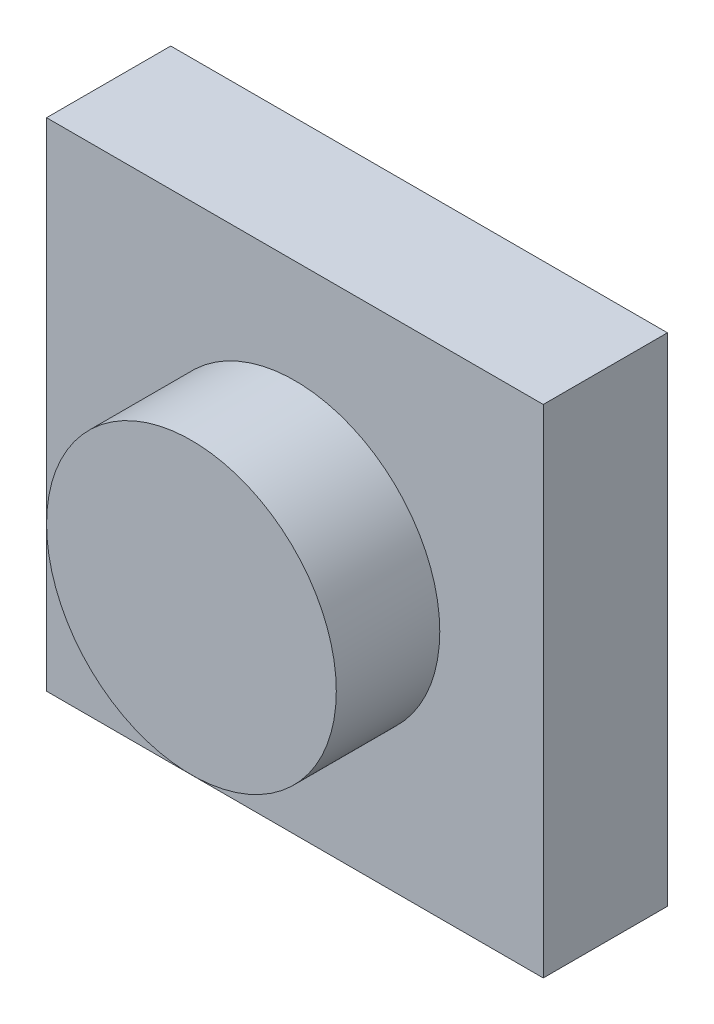
ISO-10303-21;
HEADER;
FILE_DESCRIPTION(('STEP AP214'),'2;1');
FILE_NAME('part.step','',(''),(''),'','','');
FILE_SCHEMA(('AUTOMOTIVE_DESIGN { 1 0 10303 214 1 1 1 1 }'));
ENDSEC;
DATA;
#1=APPLICATION_CONTEXT('core data for automotive mechanical design processes');
#2=APPLICATION_PROTOCOL_DEFINITION('international standard','automotive_design',2000,#1);
#3=PRODUCT_CONTEXT('',#1,'mechanical');
#4=PRODUCT('Part','Part','',(#3));
#5=PRODUCT_RELATED_PRODUCT_CATEGORY('part','',(#4));
#6=PRODUCT_DEFINITION_FORMATION('','',#4);
#7=PRODUCT_DEFINITION_CONTEXT('part definition',#1,'design');
#8=PRODUCT_DEFINITION('design','',#6,#7);
#9=PRODUCT_DEFINITION_SHAPE('','',#8);
#10=(LENGTH_UNIT() NAMED_UNIT(*) SI_UNIT(.MILLI.,.METRE.));
#11=(NAMED_UNIT(*) PLANE_ANGLE_UNIT() SI_UNIT($,.RADIAN.));
#12=(NAMED_UNIT(*) SI_UNIT($,.STERADIAN.) SOLID_ANGLE_UNIT());
#13=UNCERTAINTY_MEASURE_WITH_UNIT(LENGTH_MEASURE(1.E-05),#10,'distance_accuracy_value','');
#14=(GEOMETRIC_REPRESENTATION_CONTEXT(3) GLOBAL_UNCERTAINTY_ASSIGNED_CONTEXT((#13)) GLOBAL_UNIT_ASSIGNED_CONTEXT((#10,
#11,#12)) REPRESENTATION_CONTEXT('',''));
#15=CARTESIAN_POINT('',(0.,0.,0.));
#16=DIRECTION('',(0.,0.,1.));
#17=DIRECTION('',(1.,0.,0.));
#18=AXIS2_PLACEMENT_3D('',#15,#16,#17);
#19=CARTESIAN_POINT('',(0.,120.,30.));
#20=DIRECTION('',(0.,0.,-1.));
#21=DIRECTION('',(-1.,0.,0.));
#22=AXIS2_PLACEMENT_3D('',#19,#20,#21);
#23=PLANE('',#22);
#24=DIRECTION('',(0.,-1.,0.));
#25=VECTOR('',#24,1.);
#26=CARTESIAN_POINT('',(0.,0.,30.));
#27=LINE('',#26,#25);
#28=CARTESIAN_POINT('',(0.,120.,30.));
#29=VERTEX_POINT('',#28);
#30=CARTESIAN_POINT('',(0.,0.,30.));
#31=VERTEX_POINT('',#30);
#32=EDGE_CURVE('E93',#29,#31,#27,.T.);
#33=ORIENTED_EDGE('',*,*,#32,.T.);
#34=DIRECTION('',(1.,0.,0.));
#35=VECTOR('',#34,1.);
#36=CARTESIAN_POINT('',(0.,0.,30.));
#37=LINE('',#36,#35);
#38=CARTESIAN_POINT('',(120.,0.,30.));
#39=VERTEX_POINT('',#38);
#40=EDGE_CURVE('E88',#31,#39,#37,.T.);
#41=ORIENTED_EDGE('',*,*,#40,.T.);
#42=DIRECTION('',(0.,1.,0.));
#43=VECTOR('',#42,1.);
#44=CARTESIAN_POINT('',(120.,0.,30.));
#45=LINE('',#44,#43);
#46=CARTESIAN_POINT('',(120.,120.,30.));
#47=VERTEX_POINT('',#46);
#48=EDGE_CURVE('E91',#39,#47,#45,.T.);
#49=ORIENTED_EDGE('',*,*,#48,.T.);
#50=DIRECTION('',(-1.,0.,0.));
#51=VECTOR('',#50,1.);
#52=CARTESIAN_POINT('',(0.,120.,30.));
#53=LINE('',#52,#51);
#54=EDGE_CURVE('E57',#47,#29,#53,.T.);
#55=ORIENTED_EDGE('',*,*,#54,.T.);
#56=EDGE_LOOP('',(#33,#41,#49,#55));
#57=FACE_BOUND('',#56,.T.);
#58=CARTESIAN_POINT('',(60.,60.,30.));
#59=DIRECTION('',(0.,0.,-1.));
#60=DIRECTION('',(-1.,0.,0.));
#61=AXIS2_PLACEMENT_3D('',#58,#59,#60);
#62=CIRCLE('',#61,35.);
#63=CARTESIAN_POINT('',(25.,60.,30.));
#64=VERTEX_POINT('',#63);
#65=EDGE_CURVE('E11',#64,#64,#62,.F.);
#66=ORIENTED_EDGE('',*,*,#65,.F.);
#67=EDGE_LOOP('',(#66));
#68=FACE_BOUND('',#67,.T.);
#69=ADVANCED_FACE('F40',(#57,#68),#23,.F.);
#70=CARTESIAN_POINT('',(0.,0.,30.));
#71=DIRECTION('',(1.,0.,0.));
#72=DIRECTION('',(0.,1.,0.));
#73=AXIS2_PLACEMENT_3D('',#70,#71,#72);
#74=PLANE('',#73);
#75=DIRECTION('',(0.,-1.,0.));
#76=VECTOR('',#75,1.);
#77=CARTESIAN_POINT('',(0.,0.,0.));
#78=LINE('',#77,#76);
#79=CARTESIAN_POINT('',(0.,120.,0.));
#80=VERTEX_POINT('',#79);
#81=CARTESIAN_POINT('',(0.,0.,0.));
#82=VERTEX_POINT('',#81);
#83=EDGE_CURVE('E107',#80,#82,#78,.T.);
#84=ORIENTED_EDGE('',*,*,#83,.T.);
#85=DIRECTION('',(0.,0.,-1.));
#86=VECTOR('',#85,1.);
#87=CARTESIAN_POINT('',(0.,0.,30.));
#88=LINE('',#87,#86);
#89=EDGE_CURVE('E49',#31,#82,#88,.T.);
#90=ORIENTED_EDGE('',*,*,#89,.F.);
#91=ORIENTED_EDGE('',*,*,#32,.F.);
#92=DIRECTION('',(0.,0.,-1.));
#93=VECTOR('',#92,1.);
#94=CARTESIAN_POINT('',(0.,120.,30.));
#95=LINE('',#94,#93);
#96=EDGE_CURVE('E103',#29,#80,#95,.T.);
#97=ORIENTED_EDGE('',*,*,#96,.T.);
#98=EDGE_LOOP('',(#84,#90,#91,#97));
#99=FACE_BOUND('',#98,.T.);
#100=ADVANCED_FACE('F42',(#99),#74,.F.);
#101=CARTESIAN_POINT('',(0.,0.,30.));
#102=DIRECTION('',(0.,1.,0.));
#103=DIRECTION('',(0.,0.,1.));
#104=AXIS2_PLACEMENT_3D('',#101,#102,#103);
#105=PLANE('',#104);
#106=DIRECTION('',(1.,0.,0.));
#107=VECTOR('',#106,1.);
#108=CARTESIAN_POINT('',(0.,0.,0.));
#109=LINE('',#108,#107);
#110=CARTESIAN_POINT('',(120.,0.,0.));
#111=VERTEX_POINT('',#110);
#112=EDGE_CURVE('E98',#82,#111,#109,.T.);
#113=ORIENTED_EDGE('',*,*,#112,.T.);
#114=DIRECTION('',(0.,0.,-1.));
#115=VECTOR('',#114,1.);
#116=CARTESIAN_POINT('',(120.,0.,30.));
#117=LINE('',#116,#115);
#118=EDGE_CURVE('E96',#39,#111,#117,.T.);
#119=ORIENTED_EDGE('',*,*,#118,.F.);
#120=ORIENTED_EDGE('',*,*,#40,.F.);
#121=ORIENTED_EDGE('',*,*,#89,.T.);
#122=EDGE_LOOP('',(#113,#119,#120,#121));
#123=FACE_BOUND('',#122,.T.);
#124=ADVANCED_FACE('F97',(#123),#105,.F.);
#125=CARTESIAN_POINT('',(120.,0.,30.));
#126=DIRECTION('',(-1.,0.,0.));
#127=DIRECTION('',(0.,-1.,0.));
#128=AXIS2_PLACEMENT_3D('',#125,#126,#127);
#129=PLANE('',#128);
#130=DIRECTION('',(0.,1.,0.));
#131=VECTOR('',#130,1.);
#132=CARTESIAN_POINT('',(120.,0.,0.));
#133=LINE('',#132,#131);
#134=CARTESIAN_POINT('',(120.,120.,0.));
#135=VERTEX_POINT('',#134);
#136=EDGE_CURVE('E74',#111,#135,#133,.T.);
#137=ORIENTED_EDGE('',*,*,#136,.T.);
#138=DIRECTION('',(0.,0.,-1.));
#139=VECTOR('',#138,1.);
#140=CARTESIAN_POINT('',(120.,120.,30.));
#141=LINE('',#140,#139);
#142=EDGE_CURVE('E99',#47,#135,#141,.T.);
#143=ORIENTED_EDGE('',*,*,#142,.F.);
#144=ORIENTED_EDGE('',*,*,#48,.F.);
#145=ORIENTED_EDGE('',*,*,#118,.T.);
#146=EDGE_LOOP('',(#137,#143,#144,#145));
#147=FACE_BOUND('',#146,.T.);
#148=ADVANCED_FACE('F101',(#147),#129,.F.);
#149=CARTESIAN_POINT('',(0.,120.,30.));
#150=DIRECTION('',(0.,-1.,0.));
#151=DIRECTION('',(0.,0.,-1.));
#152=AXIS2_PLACEMENT_3D('',#149,#150,#151);
#153=PLANE('',#152);
#154=DIRECTION('',(-1.,0.,0.));
#155=VECTOR('',#154,1.);
#156=CARTESIAN_POINT('',(0.,120.,0.));
#157=LINE('',#156,#155);
#158=EDGE_CURVE('E80',#135,#80,#157,.T.);
#159=ORIENTED_EDGE('',*,*,#158,.T.);
#160=ORIENTED_EDGE('',*,*,#96,.F.);
#161=ORIENTED_EDGE('',*,*,#54,.F.);
#162=ORIENTED_EDGE('',*,*,#142,.T.);
#163=EDGE_LOOP('',(#159,#160,#161,#162));
#164=FACE_BOUND('',#163,.T.);
#165=ADVANCED_FACE('F121',(#164),#153,.F.);
#166=CARTESIAN_POINT('',(0.,120.,0.));
#167=DIRECTION('',(0.,0.,-1.));
#168=DIRECTION('',(-1.,0.,0.));
#169=AXIS2_PLACEMENT_3D('',#166,#167,#168);
#170=PLANE('',#169);
#171=ORIENTED_EDGE('',*,*,#83,.F.);
#172=ORIENTED_EDGE('',*,*,#158,.F.);
#173=ORIENTED_EDGE('',*,*,#136,.F.);
#174=ORIENTED_EDGE('',*,*,#112,.F.);
#175=EDGE_LOOP('',(#171,#172,#173,#174));
#176=FACE_BOUND('',#175,.T.);
#177=ADVANCED_FACE('F118',(#176),#170,.T.);
#178=CARTESIAN_POINT('',(60.,60.,55.));
#179=DIRECTION('',(0.,0.,-1.));
#180=DIRECTION('',(-1.,0.,0.));
#181=AXIS2_PLACEMENT_3D('',#178,#179,#180);
#182=CYLINDRICAL_SURFACE('',#181,35.);
#183=CARTESIAN_POINT('',(60.,60.,55.));
#184=DIRECTION('',(0.,0.,1.));
#185=DIRECTION('',(1.,0.,0.));
#186=AXIS2_PLACEMENT_3D('',#183,#184,#185);
#187=CIRCLE('',#186,35.);
#188=CARTESIAN_POINT('',(95.,60.,55.));
#189=VERTEX_POINT('',#188);
#190=EDGE_CURVE('E110',#189,#189,#187,.T.);
#191=ORIENTED_EDGE('',*,*,#190,.F.);
#192=EDGE_LOOP('',(#191));
#193=FACE_BOUND('',#192,.T.);
#194=ORIENTED_EDGE('',*,*,#65,.T.);
#195=EDGE_LOOP('',(#194));
#196=FACE_BOUND('',#195,.T.);
#197=ADVANCED_FACE('F120',(#193,#196),#182,.T.);
#198=CARTESIAN_POINT('',(60.,60.,55.));
#199=DIRECTION('',(0.,0.,1.));
#200=DIRECTION('',(1.,0.,0.));
#201=AXIS2_PLACEMENT_3D('',#198,#199,#200);
#202=PLANE('',#201);
#203=ORIENTED_EDGE('',*,*,#190,.T.);
#204=EDGE_LOOP('',(#203));
#205=FACE_BOUND('',#204,.T.);
#206=ADVANCED_FACE('F127',(#205),#202,.T.);
#207=CLOSED_SHELL('',(#69,#100,#124,#148,#165,#177,#197,#206));
#208=MANIFOLD_SOLID_BREP('B2',#207);
#209=ADVANCED_BREP_SHAPE_REPRESENTATION('',(#18,#208),#14);
#210=SHAPE_DEFINITION_REPRESENTATION(#9,#209);
ENDSEC;
END-ISO-10303-21;
